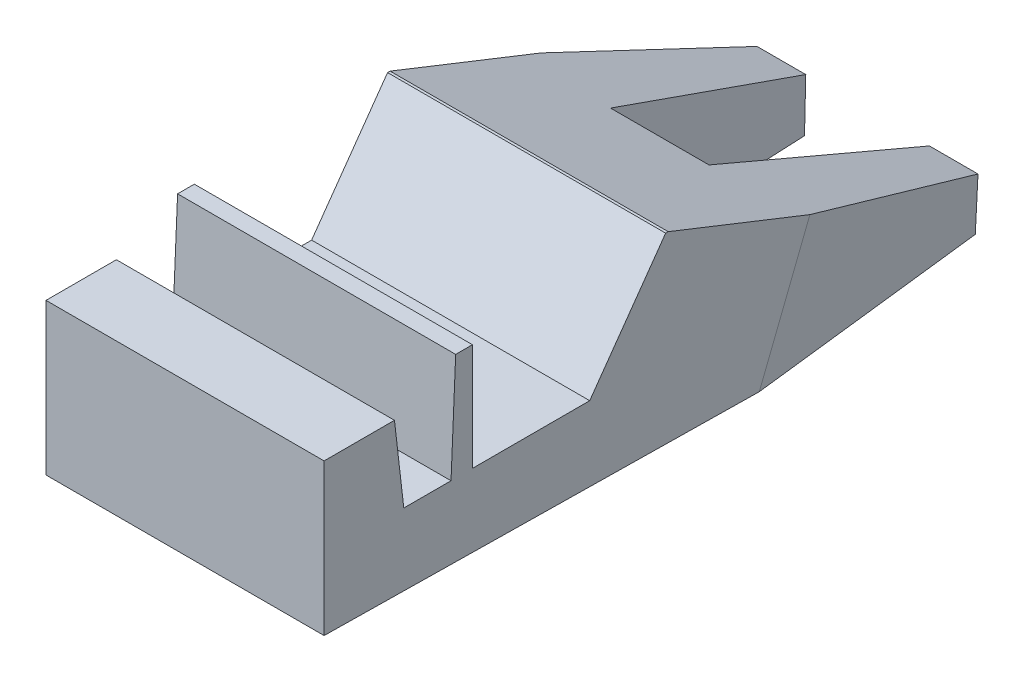
ISO-10303-21;
HEADER;
FILE_DESCRIPTION(('STEP AP214'),'2;1');
FILE_NAME('part.step','',(''),(''),'','','');
FILE_SCHEMA(('AUTOMOTIVE_DESIGN { 1 0 10303 214 1 1 1 1 }'));
ENDSEC;
DATA;
#1=APPLICATION_CONTEXT('core data for automotive mechanical design processes');
#2=APPLICATION_PROTOCOL_DEFINITION('international standard','automotive_design',2000,#1);
#3=PRODUCT_CONTEXT('',#1,'mechanical');
#4=PRODUCT('Part','Part','',(#3));
#5=PRODUCT_RELATED_PRODUCT_CATEGORY('part','',(#4));
#6=PRODUCT_DEFINITION_FORMATION('','',#4);
#7=PRODUCT_DEFINITION_CONTEXT('part definition',#1,'design');
#8=PRODUCT_DEFINITION('design','',#6,#7);
#9=PRODUCT_DEFINITION_SHAPE('','',#8);
#10=(LENGTH_UNIT() NAMED_UNIT(*) SI_UNIT(.MILLI.,.METRE.));
#11=(NAMED_UNIT(*) PLANE_ANGLE_UNIT() SI_UNIT($,.RADIAN.));
#12=(NAMED_UNIT(*) SI_UNIT($,.STERADIAN.) SOLID_ANGLE_UNIT());
#13=UNCERTAINTY_MEASURE_WITH_UNIT(LENGTH_MEASURE(1.E-05),#10,'distance_accuracy_value','');
#14=(GEOMETRIC_REPRESENTATION_CONTEXT(3) GLOBAL_UNCERTAINTY_ASSIGNED_CONTEXT((#13)) GLOBAL_UNIT_ASSIGNED_CONTEXT((#10,
#11,#12)) REPRESENTATION_CONTEXT('',''));
#15=CARTESIAN_POINT('',(0.,0.,0.));
#16=DIRECTION('',(0.,0.,1.));
#17=DIRECTION('',(1.,0.,0.));
#18=AXIS2_PLACEMENT_3D('',#15,#16,#17);
#19=CARTESIAN_POINT('',(195.008255004883,135.,-483.471862792969));
#20=DIRECTION('',(1.,0.,0.));
#21=DIRECTION('',(0.,0.,-1.));
#22=AXIS2_PLACEMENT_3D('',#19,#20,#21);
#23=PLANE('',#22);
#24=DIRECTION('',(0.,0.0147330853198422,0.999891462208253));
#25=VECTOR('',#24,1.);
#26=CARTESIAN_POINT('',(195.008255004883,3.3345488903547,-481.531813899472));
#27=LINE('',#26,#25);
#28=CARTESIAN_POINT('',(195.008255004883,5.86783415359798,-309.605143343677));
#29=VERTEX_POINT('',#28);
#30=CARTESIAN_POINT('',(195.008255004883,10.3640152345825,-4.46246767044067));
#31=VERTEX_POINT('',#30);
#32=EDGE_CURVE('E227',#29,#31,#27,.T.);
#33=ORIENTED_EDGE('',*,*,#32,.F.);
#34=DIRECTION('',(0.,0.929848464554954,-0.367942703372134));
#35=VECTOR('',#34,1.);
#36=CARTESIAN_POINT('',(195.008255004883,-90.2950607742076,-271.553313532072));
#37=LINE('',#36,#35);
#38=CARTESIAN_POINT('',(195.008255004883,95.6746321367833,-345.141854206498));
#39=VERTEX_POINT('',#38);
#40=EDGE_CURVE('E195',#29,#39,#37,.T.);
#41=ORIENTED_EDGE('',*,*,#40,.T.);
#42=DIRECTION('',(0.,0.367942703372134,0.929848464554954));
#43=VECTOR('',#42,1.);
#44=CARTESIAN_POINT('',(195.008255004883,53.6715941934378,-451.290066904609));
#45=LINE('',#44,#43);
#46=CARTESIAN_POINT('',(195.008255004883,135.,-245.760530455425));
#47=VERTEX_POINT('',#46);
#48=EDGE_CURVE('E214',#39,#47,#45,.T.);
#49=ORIENTED_EDGE('',*,*,#48,.T.);
#50=DIRECTION('',(0.,0.,1.));
#51=VECTOR('',#50,1.);
#52=CARTESIAN_POINT('',(195.008255004883,135.,-483.471862792969));
#53=LINE('',#52,#51);
#54=CARTESIAN_POINT('',(195.008255004883,135.,-243.967165231705));
#55=VERTEX_POINT('',#54);
#56=EDGE_CURVE('E238',#47,#55,#53,.T.);
#57=ORIENTED_EDGE('',*,*,#56,.T.);
#58=DIRECTION('',(0.,0.81579802568441,-0.578336909845307));
#59=VECTOR('',#58,1.);
#60=CARTESIAN_POINT('',(195.008255004883,247.99977949922,-324.07515916066));
#61=LINE('',#60,#59);
#62=CARTESIAN_POINT('',(195.008255004883,59.8868647396499,-190.717834922503));
#63=VERTEX_POINT('',#62);
#64=EDGE_CURVE('E217',#63,#55,#61,.T.);
#65=ORIENTED_EDGE('',*,*,#64,.F.);
#66=DIRECTION('',(0.,0.,-1.));
#67=VECTOR('',#66,1.);
#68=CARTESIAN_POINT('',(195.008255004883,59.8868647396499,-483.471862792969));
#69=LINE('',#68,#67);
#70=CARTESIAN_POINT('',(195.008255004883,59.8868647396499,-108.474701811792));
#71=VERTEX_POINT('',#70);
#72=EDGE_CURVE('E260',#71,#63,#69,.T.);
#73=ORIENTED_EDGE('',*,*,#72,.F.);
#74=DIRECTION('',(0.,1.,0.));
#75=VECTOR('',#74,1.);
#76=CARTESIAN_POINT('',(195.008255004883,135.,-108.474701811792));
#77=LINE('',#76,#75);
#78=CARTESIAN_POINT('',(195.008255004883,135.,-108.474701811792));
#79=VERTEX_POINT('',#78);
#80=EDGE_CURVE('E220',#71,#79,#77,.T.);
#81=ORIENTED_EDGE('',*,*,#80,.T.);
#82=CARTESIAN_POINT('',(195.008255004883,135.,-96.7315175697491));
#83=VERTEX_POINT('',#82);
#84=EDGE_CURVE('E234',#79,#83,#53,.T.);
#85=ORIENTED_EDGE('',*,*,#84,.T.);
#86=DIRECTION('',(0.,0.999054745843953,-0.0434696998687046));
#87=VECTOR('',#86,1.);
#88=CARTESIAN_POINT('',(195.008255004883,151.795595606268,-97.4623078524217));
#89=LINE('',#88,#87);
#90=CARTESIAN_POINT('',(195.008255004883,59.8868647396499,-93.4632828112959));
#91=VERTEX_POINT('',#90);
#92=EDGE_CURVE('E224',#91,#83,#89,.T.);
#93=ORIENTED_EDGE('',*,*,#92,.F.);
#94=DIRECTION('',(0.,0.,-1.));
#95=VECTOR('',#94,1.);
#96=CARTESIAN_POINT('',(195.008255004883,59.8868647396499,-483.471862792969));
#97=LINE('',#96,#95);
#98=CARTESIAN_POINT('',(195.008255004883,59.8868647396499,-60.3451705923032));
#99=VERTEX_POINT('',#98);
#100=EDGE_CURVE('E269',#99,#91,#97,.T.);
#101=ORIENTED_EDGE('',*,*,#100,.F.);
#102=DIRECTION('',(0.,-0.993385689273773,-0.114825399394349));
#103=VECTOR('',#102,1.);
#104=CARTESIAN_POINT('',(195.008255004883,85.7453123336705,-57.3561939996647));
#105=LINE('',#104,#103);
#106=CARTESIAN_POINT('',(195.008255004883,116.435636272063,-53.8087010753967));
#107=VERTEX_POINT('',#106);
#108=EDGE_CURVE('E266',#107,#99,#105,.T.);
#109=ORIENTED_EDGE('',*,*,#108,.F.);
#110=DIRECTION('',(0.,0.,-1.));
#111=VECTOR('',#110,1.);
#112=CARTESIAN_POINT('',(195.008255004883,116.435636272063,-483.471862792969));
#113=LINE('',#112,#111);
#114=CARTESIAN_POINT('',(195.008255004883,116.435636272063,-4.46246767044067));
#115=VERTEX_POINT('',#114);
#116=EDGE_CURVE('E263',#115,#107,#113,.T.);
#117=ORIENTED_EDGE('',*,*,#116,.F.);
#118=DIRECTION('',(0.,-1.,0.));
#119=VECTOR('',#118,1.);
#120=CARTESIAN_POINT('',(195.008255004883,135.,-4.46246767044067));
#121=LINE('',#120,#119);
#122=EDGE_CURVE('E239',#115,#31,#121,.T.);
#123=ORIENTED_EDGE('',*,*,#122,.T.);
#124=EDGE_LOOP('',(#33,#41,#49,#57,#65,#73,#81,#85,#93,#101,#109,#117,#123));
#125=FACE_BOUND('',#124,.T.);
#126=ADVANCED_FACE('F44',(#125),#23,.T.);
#127=CARTESIAN_POINT('',(0.,135.,-483.471862792969));
#128=DIRECTION('',(0.,0.,-1.));
#129=DIRECTION('',(-1.,0.,0.));
#130=AXIS2_PLACEMENT_3D('',#127,#128,#129);
#131=PLANE('',#130);
#132=DIRECTION('',(-1.,0.,0.));
#133=VECTOR('',#132,1.);
#134=CARTESIAN_POINT('',(200.,40.9371999024274,-483.471862792969));
#135=LINE('',#134,#133);
#136=CARTESIAN_POINT('',(174.530095187329,40.9371999024276,-483.471862792969));
#137=VERTEX_POINT('',#136);
#138=CARTESIAN_POINT('',(140.455159464957,40.9371999024276,-483.471862792969));
#139=VERTEX_POINT('',#138);
#140=EDGE_CURVE('E206',#137,#139,#135,.T.);
#141=ORIENTED_EDGE('',*,*,#140,.F.);
#142=DIRECTION('',(-0.0505836971163005,-0.998719825369481,0.));
#143=VECTOR('',#142,1.);
#144=CARTESIAN_POINT('',(178.835476277809,125.942244926059,-483.471862792969));
#145=LINE('',#144,#143);
#146=CARTESIAN_POINT('',(172.624128121082,3.30596288181989,-483.471862792969));
#147=VERTEX_POINT('',#146);
#148=EDGE_CURVE('E304',#137,#147,#145,.T.);
#149=ORIENTED_EDGE('',*,*,#148,.T.);
#150=DIRECTION('',(-1.,0.,0.));
#151=VECTOR('',#150,1.);
#152=CARTESIAN_POINT('',(200.,3.30596288181989,-483.471862792969));
#153=LINE('',#152,#151);
#154=CARTESIAN_POINT('',(141.117300810406,3.30596288181989,-483.471862792969));
#155=VERTEX_POINT('',#154);
#156=EDGE_CURVE('E296',#147,#155,#153,.T.);
#157=ORIENTED_EDGE('',*,*,#156,.T.);
#158=DIRECTION('',(0.0175928011237505,-0.999845234698161,0.));
#159=VECTOR('',#158,1.);
#160=CARTESIAN_POINT('',(138.757115633598,137.441504199982,-483.471862792969));
#161=LINE('',#160,#159);
#162=EDGE_CURVE('E353',#139,#155,#161,.T.);
#163=ORIENTED_EDGE('',*,*,#162,.F.);
#164=EDGE_LOOP('',(#141,#149,#157,#163));
#165=FACE_BOUND('',#164,.T.);
#166=ADVANCED_FACE('F381',(#165),#131,.T.);
#167=DIRECTION('',(0.0508815385932508,-0.998704695608458,0.));
#168=VECTOR('',#167,1.);
#169=CARTESIAN_POINT('',(14.7731165368563,135.752653815005,-483.471862792969));
#170=LINE('',#169,#168);
#171=CARTESIAN_POINT('',(19.6037298289568,40.9371999024275,-483.471862792969));
#172=VERTEX_POINT('',#171);
#173=CARTESIAN_POINT('',(21.5209484494312,3.30596288181989,-483.471862792969));
#174=VERTEX_POINT('',#173);
#175=EDGE_CURVE('E68',#172,#174,#170,.T.);
#176=ORIENTED_EDGE('',*,*,#175,.F.);
#177=CARTESIAN_POINT('',(53.7476281647784,40.9371999024276,-483.471862792969));
#178=VERTEX_POINT('',#177);
#179=EDGE_CURVE('E193',#178,#172,#135,.T.);
#180=ORIENTED_EDGE('',*,*,#179,.F.);
#181=DIRECTION('',(-0.0234439604024954,-0.999725152589774,0.));
#182=VECTOR('',#181,1.);
#183=CARTESIAN_POINT('',(55.9226858981922,133.68859032865,-483.471862792969));
#184=LINE('',#183,#182);
#185=CARTESIAN_POINT('',(52.8651603901879,3.30596288181989,-483.471862792969));
#186=VERTEX_POINT('',#185);
#187=EDGE_CURVE('E294',#178,#186,#184,.T.);
#188=ORIENTED_EDGE('',*,*,#187,.T.);
#189=EDGE_CURVE('E289',#186,#174,#153,.T.);
#190=ORIENTED_EDGE('',*,*,#189,.T.);
#191=EDGE_LOOP('',(#176,#180,#188,#190));
#192=FACE_BOUND('',#191,.T.);
#193=ADVANCED_FACE('F293',(#192),#131,.T.);
#194=CARTESIAN_POINT('',(200.,200.805738217705,-79.4591903830507));
#195=DIRECTION('',(0.,0.929848464554954,-0.367942703372134));
#196=DIRECTION('',(0.,0.367942703372134,0.929848464554954));
#197=AXIS2_PLACEMENT_3D('',#194,#195,#196);
#198=PLANE('',#197);
#199=ORIENTED_EDGE('',*,*,#48,.F.);
#200=DIRECTION('',(-0.136367412023684,-0.364505504455656,-0.921162128053195));
#201=VECTOR('',#200,1.);
#202=CARTESIAN_POINT('',(229.981710209926,189.157501268725,-108.896097658331));
#203=LINE('',#202,#201);
#204=EDGE_CURVE('E372',#39,#137,#203,.T.);
#205=ORIENTED_EDGE('',*,*,#204,.T.);
#206=ORIENTED_EDGE('',*,*,#140,.T.);
#207=DIRECTION('',(0.0477667830480464,-0.367522702562298,-0.928787057154946));
#208=VECTOR('',#207,1.);
#209=CARTESIAN_POINT('',(119.404044436364,202.906714983149,-74.1496951776584));
#210=LINE('',#209,#208);
#211=CARTESIAN_POINT('',(132.896060193834,99.0977126224375,-336.491197176308));
#212=VERTEX_POINT('',#211);
#213=EDGE_CURVE('E359',#212,#139,#210,.T.);
#214=ORIENTED_EDGE('',*,*,#213,.F.);
#215=DIRECTION('',(1.,0.,0.));
#216=VECTOR('',#215,1.);
#217=CARTESIAN_POINT('',(0.,99.0977126224374,-336.491197176308));
#218=LINE('',#217,#216);
#219=CARTESIAN_POINT('',(63.8220051200018,99.0977126224374,-336.491197176308));
#220=VERTEX_POINT('',#219);
#221=EDGE_CURVE('E364',#220,#212,#218,.T.);
#222=ORIENTED_EDGE('',*,*,#221,.F.);
#223=DIRECTION('',(-0.0636048011308657,-0.36719767998232,-0.927965674520725));
#224=VECTOR('',#223,1.);
#225=CARTESIAN_POINT('',(81.1100727683267,198.903674106086,-84.2660023607449));
#226=LINE('',#225,#224);
#227=EDGE_CURVE('E182',#220,#178,#226,.T.);
#228=ORIENTED_EDGE('',*,*,#227,.T.);
#229=ORIENTED_EDGE('',*,*,#179,.T.);
#230=DIRECTION('',(0.137157333403429,-0.36446537800935,-0.921060722279569));
#231=VECTOR('',#230,1.);
#232=CARTESIAN_POINT('',(-39.7957572798263,198.77824263389,-84.5829872085453));
#233=LINE('',#232,#231);
#234=CARTESIAN_POINT('',(0.,93.0297903983964,-351.825780825754));
#235=VERTEX_POINT('',#234);
#236=EDGE_CURVE('E176',#235,#172,#233,.T.);
#237=ORIENTED_EDGE('',*,*,#236,.F.);
#238=DIRECTION('',(0.,-0.367942703372134,-0.929848464554954));
#239=VECTOR('',#238,1.);
#240=CARTESIAN_POINT('',(0.,200.805738217705,-79.4591903830507));
#241=LINE('',#240,#239);
#242=CARTESIAN_POINT('',(0.,135.,-245.760530455425));
#243=VERTEX_POINT('',#242);
#244=EDGE_CURVE('E189',#243,#235,#241,.T.);
#245=ORIENTED_EDGE('',*,*,#244,.F.);
#246=DIRECTION('',(-1.,0.,0.));
#247=VECTOR('',#246,1.);
#248=CARTESIAN_POINT('',(0.,135.,-245.760530455426));
#249=LINE('',#248,#247);
#250=EDGE_CURVE('E247',#47,#243,#249,.T.);
#251=ORIENTED_EDGE('',*,*,#250,.F.);
#252=EDGE_LOOP('',(#199,#205,#206,#214,#222,#228,#229,#237,#245,#251));
#253=FACE_BOUND('',#252,.T.);
#254=ADVANCED_FACE('F187',(#253),#198,.T.);
#255=CARTESIAN_POINT('',(200.,10.4275043630299,-0.153645987849779));
#256=DIRECTION('',(0.,0.999891462208253,-0.0147330853198422));
#257=DIRECTION('',(0.,0.0147330853198422,0.999891462208253));
#258=AXIS2_PLACEMENT_3D('',#255,#256,#257);
#259=PLANE('',#258);
#260=DIRECTION('',(-0.127675528764003,-0.0146125096121704,-0.991708341155638));
#261=VECTOR('',#260,1.);
#262=CARTESIAN_POINT('',(234.279917658922,10.3624898920424,-4.56598821279065));
#263=LINE('',#262,#261);
#264=EDGE_CURVE('E11',#29,#147,#263,.T.);
#265=ORIENTED_EDGE('',*,*,#264,.F.);
#266=ORIENTED_EDGE('',*,*,#32,.T.);
#267=DIRECTION('',(-1.,0.,0.));
#268=VECTOR('',#267,1.);
#269=CARTESIAN_POINT('',(200.,10.3640152345825,-4.46246767044067));
#270=LINE('',#269,#268);
#271=CARTESIAN_POINT('',(0.,10.3640152345825,-4.46246767044067));
#272=VERTEX_POINT('',#271);
#273=EDGE_CURVE('E211',#31,#272,#270,.T.);
#274=ORIENTED_EDGE('',*,*,#273,.T.);
#275=DIRECTION('',(0.,-0.0147330853198422,-0.999891462208253));
#276=VECTOR('',#275,1.);
#277=CARTESIAN_POINT('',(0.,10.4275043630299,-0.153645987849779));
#278=LINE('',#277,#276);
#279=CARTESIAN_POINT('',(0.,5.75458803077734,-317.290826883703));
#280=VERTEX_POINT('',#279);
#281=EDGE_CURVE('E290',#272,#280,#278,.T.);
#282=ORIENTED_EDGE('',*,*,#281,.T.);
#283=DIRECTION('',(0.1284168461682,-0.0146110994975951,-0.991612640798656));
#284=VECTOR('',#283,1.);
#285=CARTESIAN_POINT('',(-37.0947655940304,9.9751815674263,-30.8514727951859));
#286=LINE('',#285,#284);
#287=EDGE_CURVE('E53',#280,#174,#286,.T.);
#288=ORIENTED_EDGE('',*,*,#287,.T.);
#289=ORIENTED_EDGE('',*,*,#189,.F.);
#290=DIRECTION('',(-0.0594963054916117,-0.0147069860386624,-0.998120180236081));
#291=VECTOR('',#290,1.);
#292=CARTESIAN_POINT('',(82.0938140910645,10.5310401089814,6.87302264013018));
#293=LINE('',#292,#291);
#294=CARTESIAN_POINT('',(63.8220051200018,6.01440269396723,-299.657964666428));
#295=VERTEX_POINT('',#294);
#296=EDGE_CURVE('E280',#295,#186,#293,.T.);
#297=ORIENTED_EDGE('',*,*,#296,.F.);
#298=DIRECTION('',(1.,0.,0.));
#299=VECTOR('',#298,1.);
#300=CARTESIAN_POINT('',(200.,6.01440269396729,-299.657964666428));
#301=LINE('',#300,#299);
#302=CARTESIAN_POINT('',(132.896060193834,6.01440269396729,-299.657964666428));
#303=VERTEX_POINT('',#302);
#304=EDGE_CURVE('E272',#295,#303,#301,.T.);
#305=ORIENTED_EDGE('',*,*,#304,.T.);
#306=DIRECTION('',(0.0446763844550129,-0.0147183745086891,-0.99889308242867));
#307=VECTOR('',#306,1.);
#308=CARTESIAN_POINT('',(119.6611376971,10.3745707844838,-3.74609333363046));
#309=LINE('',#308,#307);
#310=EDGE_CURVE('E276',#303,#155,#309,.T.);
#311=ORIENTED_EDGE('',*,*,#310,.T.);
#312=ORIENTED_EDGE('',*,*,#156,.F.);
#313=EDGE_LOOP('',(#265,#266,#274,#282,#288,#289,#297,#305,#311,#312));
#314=FACE_BOUND('',#313,.T.);
#315=ADVANCED_FACE('F287',(#314),#259,.F.);
#316=CARTESIAN_POINT('',(0.,135.,-483.471862792969));
#317=DIRECTION('',(1.,0.,0.));
#318=DIRECTION('',(0.,0.,-1.));
#319=AXIS2_PLACEMENT_3D('',#316,#317,#318);
#320=PLANE('',#319);
#321=ORIENTED_EDGE('',*,*,#244,.T.);
#322=DIRECTION('',(0.,0.929848464554954,-0.367942703372134));
#323=VECTOR('',#322,1.);
#324=CARTESIAN_POINT('',(0.,-92.9399025125944,-278.237240151327));
#325=LINE('',#324,#323);
#326=EDGE_CURVE('E173',#280,#235,#325,.T.);
#327=ORIENTED_EDGE('',*,*,#326,.F.);
#328=ORIENTED_EDGE('',*,*,#281,.F.);
#329=DIRECTION('',(0.,-1.,0.));
#330=VECTOR('',#329,1.);
#331=CARTESIAN_POINT('',(0.,135.,-4.46246767044067));
#332=LINE('',#331,#330);
#333=CARTESIAN_POINT('',(0.,116.435636272063,-4.46246767044067));
#334=VERTEX_POINT('',#333);
#335=EDGE_CURVE('E243',#334,#272,#332,.T.);
#336=ORIENTED_EDGE('',*,*,#335,.F.);
#337=DIRECTION('',(0.,0.,1.));
#338=VECTOR('',#337,1.);
#339=CARTESIAN_POINT('',(0.,116.435636272063,0.));
#340=LINE('',#339,#338);
#341=CARTESIAN_POINT('',(0.,116.435636272063,-53.8087010753967));
#342=VERTEX_POINT('',#341);
#343=EDGE_CURVE('E327',#342,#334,#340,.T.);
#344=ORIENTED_EDGE('',*,*,#343,.F.);
#345=DIRECTION('',(0.,0.993385689273773,0.114825399394349));
#346=VECTOR('',#345,1.);
#347=CARTESIAN_POINT('',(0.,7.67292737541487,-66.3805768564933));
#348=LINE('',#347,#346);
#349=CARTESIAN_POINT('',(0.,59.8868647396499,-60.3451705923032));
#350=VERTEX_POINT('',#349);
#351=EDGE_CURVE('E300',#350,#342,#348,.T.);
#352=ORIENTED_EDGE('',*,*,#351,.F.);
#353=DIRECTION('',(0.,0.,1.));
#354=VECTOR('',#353,1.);
#355=CARTESIAN_POINT('',(0.,59.8868647396499,0.));
#356=LINE('',#355,#354);
#357=CARTESIAN_POINT('',(0.,59.8868647396499,-93.4632828112959));
#358=VERTEX_POINT('',#357);
#359=EDGE_CURVE('E309',#358,#350,#356,.T.);
#360=ORIENTED_EDGE('',*,*,#359,.F.);
#361=DIRECTION('',(0.,-0.999054745843953,0.0434696998687046));
#362=VECTOR('',#361,1.);
#363=CARTESIAN_POINT('',(0.,-3.94581734791734,-90.6858699180545));
#364=LINE('',#363,#362);
#365=CARTESIAN_POINT('',(0.,135.,-96.7315175697491));
#366=VERTEX_POINT('',#365);
#367=EDGE_CURVE('E323',#366,#358,#364,.T.);
#368=ORIENTED_EDGE('',*,*,#367,.F.);
#369=DIRECTION('',(0.,0.,1.));
#370=VECTOR('',#369,1.);
#371=CARTESIAN_POINT('',(0.,135.,-483.471862792969));
#372=LINE('',#371,#370);
#373=CARTESIAN_POINT('',(0.,135.,-108.474701811792));
#374=VERTEX_POINT('',#373);
#375=EDGE_CURVE('E230',#374,#366,#372,.T.);
#376=ORIENTED_EDGE('',*,*,#375,.F.);
#377=DIRECTION('',(0.,-1.,0.));
#378=VECTOR('',#377,1.);
#379=CARTESIAN_POINT('',(0.,0.,-108.474701811792));
#380=LINE('',#379,#378);
#381=CARTESIAN_POINT('',(0.,59.8868647396499,-108.474701811792));
#382=VERTEX_POINT('',#381);
#383=EDGE_CURVE('E319',#374,#382,#380,.T.);
#384=ORIENTED_EDGE('',*,*,#383,.T.);
#385=DIRECTION('',(0.,0.,1.));
#386=VECTOR('',#385,1.);
#387=CARTESIAN_POINT('',(0.,59.8868647396499,0.));
#388=LINE('',#387,#386);
#389=CARTESIAN_POINT('',(0.,59.8868647396499,-190.717834922503));
#390=VERTEX_POINT('',#389);
#391=EDGE_CURVE('E334',#390,#382,#388,.T.);
#392=ORIENTED_EDGE('',*,*,#391,.F.);
#393=DIRECTION('',(0.,-0.81579802568441,0.578336909845307));
#394=VECTOR('',#393,1.);
#395=CARTESIAN_POINT('',(0.,-69.9512655343142,-98.6727690132789));
#396=LINE('',#395,#394);
#397=CARTESIAN_POINT('',(0.,135.,-243.967165231705));
#398=VERTEX_POINT('',#397);
#399=EDGE_CURVE('E339',#398,#390,#396,.T.);
#400=ORIENTED_EDGE('',*,*,#399,.F.);
#401=EDGE_CURVE('E200',#243,#398,#372,.T.);
#402=ORIENTED_EDGE('',*,*,#401,.F.);
#403=EDGE_LOOP('',(#321,#327,#328,#336,#344,#352,#360,#368,#376,#384,#392,#400,#402));
#404=FACE_BOUND('',#403,.T.);
#405=ADVANCED_FACE('F46',(#404),#320,.F.);
#406=CARTESIAN_POINT('',(0.,135.,0.));
#407=DIRECTION('',(0.,1.,0.));
#408=DIRECTION('',(0.,0.,1.));
#409=AXIS2_PLACEMENT_3D('',#406,#407,#408);
#410=PLANE('',#409);
#411=DIRECTION('',(-1.,0.,0.));
#412=VECTOR('',#411,1.);
#413=CARTESIAN_POINT('',(0.,135.,-96.7315175697491));
#414=LINE('',#413,#412);
#415=EDGE_CURVE('E257',#83,#366,#414,.T.);
#416=ORIENTED_EDGE('',*,*,#415,.F.);
#417=ORIENTED_EDGE('',*,*,#84,.F.);
#418=DIRECTION('',(-1.,0.,0.));
#419=VECTOR('',#418,1.);
#420=CARTESIAN_POINT('',(0.,135.,-108.474701811792));
#421=LINE('',#420,#419);
#422=EDGE_CURVE('E253',#79,#374,#421,.T.);
#423=ORIENTED_EDGE('',*,*,#422,.T.);
#424=ORIENTED_EDGE('',*,*,#375,.T.);
#425=EDGE_LOOP('',(#416,#417,#423,#424));
#426=FACE_BOUND('',#425,.T.);
#427=ADVANCED_FACE('F408',(#426),#410,.T.);
#428=DIRECTION('',(-1.,0.,0.));
#429=VECTOR('',#428,1.);
#430=CARTESIAN_POINT('',(0.,135.,-243.967165231705));
#431=LINE('',#430,#429);
#432=EDGE_CURVE('E250',#55,#398,#431,.T.);
#433=ORIENTED_EDGE('',*,*,#432,.F.);
#434=ORIENTED_EDGE('',*,*,#56,.F.);
#435=ORIENTED_EDGE('',*,*,#250,.T.);
#436=ORIENTED_EDGE('',*,*,#401,.T.);
#437=EDGE_LOOP('',(#433,#434,#435,#436));
#438=FACE_BOUND('',#437,.T.);
#439=ADVANCED_FACE('F394',(#438),#410,.T.);
#440=CARTESIAN_POINT('',(0.,135.,-4.46246767044067));
#441=DIRECTION('',(0.,0.,-1.));
#442=DIRECTION('',(-1.,0.,0.));
#443=AXIS2_PLACEMENT_3D('',#440,#441,#442);
#444=PLANE('',#443);
#445=ORIENTED_EDGE('',*,*,#335,.T.);
#446=ORIENTED_EDGE('',*,*,#273,.F.);
#447=ORIENTED_EDGE('',*,*,#122,.F.);
#448=DIRECTION('',(-1.,0.,0.));
#449=VECTOR('',#448,1.);
#450=CARTESIAN_POINT('',(200.,116.435636272063,-4.46246767044067));
#451=LINE('',#450,#449);
#452=EDGE_CURVE('E308',#115,#334,#451,.T.);
#453=ORIENTED_EDGE('',*,*,#452,.T.);
#454=EDGE_LOOP('',(#445,#446,#447,#453));
#455=FACE_BOUND('',#454,.T.);
#456=ADVANCED_FACE('F430',(#455),#444,.F.);
#457=CARTESIAN_POINT('',(200.,0.,-108.474701811792));
#458=DIRECTION('',(0.,0.,-1.));
#459=DIRECTION('',(-1.,0.,0.));
#460=AXIS2_PLACEMENT_3D('',#457,#458,#459);
#461=PLANE('',#460);
#462=DIRECTION('',(-1.,0.,0.));
#463=VECTOR('',#462,1.);
#464=CARTESIAN_POINT('',(200.,59.8868647396499,-108.474701811792));
#465=LINE('',#464,#463);
#466=EDGE_CURVE('E202',#71,#382,#465,.T.);
#467=ORIENTED_EDGE('',*,*,#466,.T.);
#468=ORIENTED_EDGE('',*,*,#383,.F.);
#469=ORIENTED_EDGE('',*,*,#422,.F.);
#470=ORIENTED_EDGE('',*,*,#80,.F.);
#471=EDGE_LOOP('',(#467,#468,#469,#470));
#472=FACE_BOUND('',#471,.T.);
#473=ADVANCED_FACE('F449',(#472),#461,.T.);
#474=CARTESIAN_POINT('',(200.,59.8868647396499,0.));
#475=DIRECTION('',(0.,-1.,0.));
#476=DIRECTION('',(0.,0.,-1.));
#477=AXIS2_PLACEMENT_3D('',#474,#475,#476);
#478=PLANE('',#477);
#479=ORIENTED_EDGE('',*,*,#72,.T.);
#480=DIRECTION('',(-1.,0.,0.));
#481=VECTOR('',#480,1.);
#482=CARTESIAN_POINT('',(200.,59.8868647396499,-190.717834922503));
#483=LINE('',#482,#481);
#484=EDGE_CURVE('E208',#63,#390,#483,.T.);
#485=ORIENTED_EDGE('',*,*,#484,.T.);
#486=ORIENTED_EDGE('',*,*,#391,.T.);
#487=ORIENTED_EDGE('',*,*,#466,.F.);
#488=EDGE_LOOP('',(#479,#485,#486,#487));
#489=FACE_BOUND('',#488,.T.);
#490=ADVANCED_FACE('F402',(#489),#478,.F.);
#491=CARTESIAN_POINT('',(200.,-69.9512655343142,-98.6727690132789));
#492=DIRECTION('',(0.,-0.578336909845307,-0.81579802568441));
#493=DIRECTION('',(0.,0.81579802568441,-0.578336909845307));
#494=AXIS2_PLACEMENT_3D('',#491,#492,#493);
#495=PLANE('',#494);
#496=ORIENTED_EDGE('',*,*,#64,.T.);
#497=ORIENTED_EDGE('',*,*,#432,.T.);
#498=ORIENTED_EDGE('',*,*,#399,.T.);
#499=ORIENTED_EDGE('',*,*,#484,.F.);
#500=EDGE_LOOP('',(#496,#497,#498,#499));
#501=FACE_BOUND('',#500,.T.);
#502=ADVANCED_FACE('F396',(#501),#495,.F.);
#503=CARTESIAN_POINT('',(200.,7.67292737541487,-66.3805768564933));
#504=DIRECTION('',(0.,-0.114825399394349,0.993385689273773));
#505=DIRECTION('',(0.,-0.993385689273773,-0.114825399394349));
#506=AXIS2_PLACEMENT_3D('',#503,#504,#505);
#507=PLANE('',#506);
#508=ORIENTED_EDGE('',*,*,#108,.T.);
#509=DIRECTION('',(-1.,0.,0.));
#510=VECTOR('',#509,1.);
#511=CARTESIAN_POINT('',(200.,59.8868647396499,-60.3451705923032));
#512=LINE('',#511,#510);
#513=EDGE_CURVE('E316',#99,#350,#512,.T.);
#514=ORIENTED_EDGE('',*,*,#513,.T.);
#515=ORIENTED_EDGE('',*,*,#351,.T.);
#516=DIRECTION('',(-1.,0.,0.));
#517=VECTOR('',#516,1.);
#518=CARTESIAN_POINT('',(200.,116.435636272063,-53.8087010753967));
#519=LINE('',#518,#517);
#520=EDGE_CURVE('E305',#107,#342,#519,.T.);
#521=ORIENTED_EDGE('',*,*,#520,.F.);
#522=EDGE_LOOP('',(#508,#514,#515,#521));
#523=FACE_BOUND('',#522,.T.);
#524=ADVANCED_FACE('F425',(#523),#507,.F.);
#525=CARTESIAN_POINT('',(200.,59.8868647396499,0.));
#526=DIRECTION('',(0.,-1.,0.));
#527=DIRECTION('',(0.,0.,-1.));
#528=AXIS2_PLACEMENT_3D('',#525,#526,#527);
#529=PLANE('',#528);
#530=ORIENTED_EDGE('',*,*,#100,.T.);
#531=DIRECTION('',(-1.,0.,0.));
#532=VECTOR('',#531,1.);
#533=CARTESIAN_POINT('',(200.,59.8868647396499,-93.4632828112959));
#534=LINE('',#533,#532);
#535=EDGE_CURVE('E313',#91,#358,#534,.T.);
#536=ORIENTED_EDGE('',*,*,#535,.T.);
#537=ORIENTED_EDGE('',*,*,#359,.T.);
#538=ORIENTED_EDGE('',*,*,#513,.F.);
#539=EDGE_LOOP('',(#530,#536,#537,#538));
#540=FACE_BOUND('',#539,.T.);
#541=ADVANCED_FACE('F418',(#540),#529,.F.);
#542=CARTESIAN_POINT('',(200.,-3.94581734791734,-90.6858699180545));
#543=DIRECTION('',(0.,-0.0434696998687046,-0.999054745843953));
#544=DIRECTION('',(0.,0.999054745843953,-0.0434696998687046));
#545=AXIS2_PLACEMENT_3D('',#542,#543,#544);
#546=PLANE('',#545);
#547=ORIENTED_EDGE('',*,*,#92,.T.);
#548=ORIENTED_EDGE('',*,*,#415,.T.);
#549=ORIENTED_EDGE('',*,*,#367,.T.);
#550=ORIENTED_EDGE('',*,*,#535,.F.);
#551=EDGE_LOOP('',(#547,#548,#549,#550));
#552=FACE_BOUND('',#551,.T.);
#553=ADVANCED_FACE('F411',(#552),#546,.F.);
#554=CARTESIAN_POINT('',(200.,116.435636272063,0.));
#555=DIRECTION('',(0.,-1.,0.));
#556=DIRECTION('',(0.,0.,-1.));
#557=AXIS2_PLACEMENT_3D('',#554,#555,#556);
#558=PLANE('',#557);
#559=ORIENTED_EDGE('',*,*,#116,.T.);
#560=ORIENTED_EDGE('',*,*,#520,.T.);
#561=ORIENTED_EDGE('',*,*,#343,.T.);
#562=ORIENTED_EDGE('',*,*,#452,.F.);
#563=EDGE_LOOP('',(#559,#560,#561,#562));
#564=FACE_BOUND('',#563,.T.);
#565=ADVANCED_FACE('F427',(#564),#558,.F.);
#566=CARTESIAN_POINT('',(0.,-86.8719802885535,-262.902656501881));
#567=DIRECTION('',(0.,0.367942703372134,0.929848464554954));
#568=DIRECTION('',(0.,-0.929848464554954,0.367942703372134));
#569=AXIS2_PLACEMENT_3D('',#566,#567,#568);
#570=PLANE('',#569);
#571=DIRECTION('',(0.,0.929848464554954,-0.367942703372134));
#572=VECTOR('',#571,1.);
#573=CARTESIAN_POINT('',(63.8220051200018,-86.8719802885535,-262.902656501881));
#574=LINE('',#573,#572);
#575=EDGE_CURVE('E356',#295,#220,#574,.T.);
#576=ORIENTED_EDGE('',*,*,#575,.T.);
#577=ORIENTED_EDGE('',*,*,#221,.T.);
#578=DIRECTION('',(0.,0.929848464554954,-0.367942703372134));
#579=VECTOR('',#578,1.);
#580=CARTESIAN_POINT('',(132.896060193834,-86.8719802885534,-262.902656501881));
#581=LINE('',#580,#579);
#582=EDGE_CURVE('E60',#303,#212,#581,.T.);
#583=ORIENTED_EDGE('',*,*,#582,.F.);
#584=ORIENTED_EDGE('',*,*,#304,.F.);
#585=EDGE_LOOP('',(#576,#577,#583,#584));
#586=FACE_BOUND('',#585,.T.);
#587=ADVANCED_FACE('F467',(#586),#570,.F.);
#588=CARTESIAN_POINT('',(81.1100727683267,12.933981195095,-10.677461686318));
#589=DIRECTION('',(0.997975164657469,-0.0234029224755377,-0.0591428266698586));
#590=DIRECTION('',(-0.0591590294937136,0.,-0.998248570862669));
#591=AXIS2_PLACEMENT_3D('',#588,#589,#590);
#592=PLANE('',#591);
#593=ORIENTED_EDGE('',*,*,#227,.F.);
#594=ORIENTED_EDGE('',*,*,#575,.F.);
#595=ORIENTED_EDGE('',*,*,#296,.T.);
#596=ORIENTED_EDGE('',*,*,#187,.F.);
#597=EDGE_LOOP('',(#593,#594,#595,#596));
#598=FACE_BOUND('',#597,.T.);
#599=ADVANCED_FACE('F476',(#598),#592,.T.);
#600=CARTESIAN_POINT('',(119.404044436364,16.937022072158,-0.561154503231548));
#601=DIRECTION('',(0.998858515725446,0.0175754392860884,0.0444158698739556));
#602=DIRECTION('',(0.0444227314073602,0.,-0.999012823208146));
#603=AXIS2_PLACEMENT_3D('',#600,#601,#602);
#604=PLANE('',#603);
#605=ORIENTED_EDGE('',*,*,#162,.T.);
#606=ORIENTED_EDGE('',*,*,#310,.F.);
#607=ORIENTED_EDGE('',*,*,#582,.T.);
#608=ORIENTED_EDGE('',*,*,#213,.T.);
#609=EDGE_LOOP('',(#605,#606,#607,#608));
#610=FACE_BOUND('',#609,.T.);
#611=ADVANCED_FACE('F438',(#610),#604,.F.);
#612=CARTESIAN_POINT('',(-39.7957572798263,12.8085497228996,-10.9944465341184));
#613=DIRECTION('',(0.990549274843842,0.0504660400397708,0.12753553586763));
#614=DIRECTION('',(0.127698251843128,0.,-0.991813065288116));
#615=AXIS2_PLACEMENT_3D('',#612,#613,#614);
#616=PLANE('',#615);
#617=ORIENTED_EDGE('',*,*,#175,.T.);
#618=ORIENTED_EDGE('',*,*,#287,.F.);
#619=ORIENTED_EDGE('',*,*,#326,.T.);
#620=ORIENTED_EDGE('',*,*,#236,.T.);
#621=EDGE_LOOP('',(#617,#618,#619,#620));
#622=FACE_BOUND('',#621,.T.);
#623=ADVANCED_FACE('F175',(#622),#616,.F.);
#624=CARTESIAN_POINT('',(229.981710209926,3.18780835773427,-35.307556983904));
#625=DIRECTION('',(0.990658331079875,-0.050175394231856,-0.126801028685556));
#626=DIRECTION('',(-0.126960945945886,0.,-0.991907716576762));
#627=AXIS2_PLACEMENT_3D('',#624,#625,#626);
#628=PLANE('',#627);
#629=ORIENTED_EDGE('',*,*,#204,.F.);
#630=ORIENTED_EDGE('',*,*,#40,.F.);
#631=ORIENTED_EDGE('',*,*,#264,.T.);
#632=ORIENTED_EDGE('',*,*,#148,.F.);
#633=EDGE_LOOP('',(#629,#630,#631,#632));
#634=FACE_BOUND('',#633,.T.);
#635=ADVANCED_FACE('F432',(#634),#628,.T.);
#636=CLOSED_SHELL('',(#126,#166,#193,#254,#315,#405,#427,#439,#456,#473,#490,#502,#524,#541,
#553,#565,#587,#599,#611,#623,#635));
#637=MANIFOLD_SOLID_BREP('B2',#636);
#638=ADVANCED_BREP_SHAPE_REPRESENTATION('',(#18,#637),#14);
#639=SHAPE_DEFINITION_REPRESENTATION(#9,#638);
ENDSEC;
END-ISO-10303-21;
